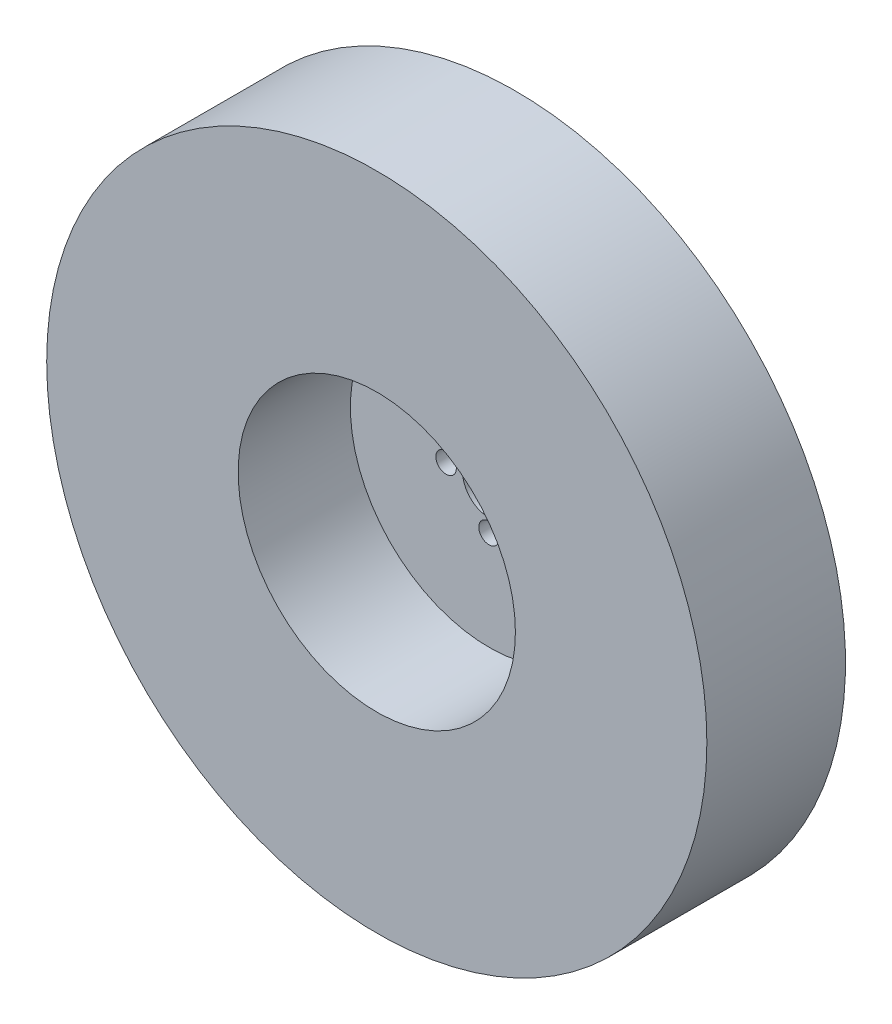
ISO-10303-21;
HEADER;
FILE_DESCRIPTION(('STEP AP214'),'2;1');
FILE_NAME('part.step','',(''),(''),'','','');
FILE_SCHEMA(('AUTOMOTIVE_DESIGN { 1 0 10303 214 1 1 1 1 }'));
ENDSEC;
DATA;
#1=APPLICATION_CONTEXT('core data for automotive mechanical design processes');
#2=APPLICATION_PROTOCOL_DEFINITION('international standard','automotive_design',2000,#1);
#3=PRODUCT_CONTEXT('',#1,'mechanical');
#4=PRODUCT('Part','Part','',(#3));
#5=PRODUCT_RELATED_PRODUCT_CATEGORY('part','',(#4));
#6=PRODUCT_DEFINITION_FORMATION('','',#4);
#7=PRODUCT_DEFINITION_CONTEXT('part definition',#1,'design');
#8=PRODUCT_DEFINITION('design','',#6,#7);
#9=PRODUCT_DEFINITION_SHAPE('','',#8);
#10=(LENGTH_UNIT() NAMED_UNIT(*) SI_UNIT(.MILLI.,.METRE.));
#11=(NAMED_UNIT(*) PLANE_ANGLE_UNIT() SI_UNIT($,.RADIAN.));
#12=(NAMED_UNIT(*) SI_UNIT($,.STERADIAN.) SOLID_ANGLE_UNIT());
#13=UNCERTAINTY_MEASURE_WITH_UNIT(LENGTH_MEASURE(1.E-05),#10,'distance_accuracy_value','');
#14=(GEOMETRIC_REPRESENTATION_CONTEXT(3) GLOBAL_UNCERTAINTY_ASSIGNED_CONTEXT((#13)) GLOBAL_UNIT_ASSIGNED_CONTEXT((#10,
#11,#12)) REPRESENTATION_CONTEXT('',''));
#15=CARTESIAN_POINT('',(0.,0.,0.));
#16=DIRECTION('',(0.,0.,1.));
#17=DIRECTION('',(1.,0.,0.));
#18=AXIS2_PLACEMENT_3D('',#15,#16,#17);
#19=CARTESIAN_POINT('',(0.,0.,17.));
#20=DIRECTION('',(0.,0.,1.));
#21=DIRECTION('',(1.,0.,0.));
#22=AXIS2_PLACEMENT_3D('',#19,#20,#21);
#23=PLANE('',#22);
#24=CARTESIAN_POINT('',(0.,0.,17.));
#25=DIRECTION('',(0.,0.,1.));
#26=DIRECTION('',(1.,0.,0.));
#27=AXIS2_PLACEMENT_3D('',#24,#25,#26);
#28=CIRCLE('',#27,50.);
#29=CARTESIAN_POINT('',(50.,0.,17.));
#30=VERTEX_POINT('',#29);
#31=EDGE_CURVE('E10',#30,#30,#28,.T.);
#32=ORIENTED_EDGE('',*,*,#31,.T.);
#33=EDGE_LOOP('',(#32));
#34=FACE_BOUND('',#33,.T.);
#35=CARTESIAN_POINT('',(0.,0.,17.));
#36=DIRECTION('',(0.,0.,1.));
#37=DIRECTION('',(1.,0.,0.));
#38=AXIS2_PLACEMENT_3D('',#35,#36,#37);
#39=CIRCLE('',#38,21.);
#40=CARTESIAN_POINT('',(21.,0.,17.));
#41=VERTEX_POINT('',#40);
#42=EDGE_CURVE('E39',#41,#41,#39,.T.);
#43=ORIENTED_EDGE('',*,*,#42,.F.);
#44=EDGE_LOOP('',(#43));
#45=FACE_BOUND('',#44,.T.);
#46=ADVANCED_FACE('F31',(#34,#45),#23,.T.);
#47=CARTESIAN_POINT('',(0.,0.,17.));
#48=DIRECTION('',(0.,0.,-1.));
#49=DIRECTION('',(-1.,0.,0.));
#50=AXIS2_PLACEMENT_3D('',#47,#48,#49);
#51=CYLINDRICAL_SURFACE('',#50,50.);
#52=ORIENTED_EDGE('',*,*,#31,.F.);
#53=EDGE_LOOP('',(#52));
#54=FACE_BOUND('',#53,.T.);
#55=CARTESIAN_POINT('',(0.,0.,-4.));
#56=DIRECTION('',(0.,0.,-1.));
#57=DIRECTION('',(-1.,0.,0.));
#58=AXIS2_PLACEMENT_3D('',#55,#56,#57);
#59=CIRCLE('',#58,50.);
#60=CARTESIAN_POINT('',(-50.,0.,-4.));
#61=VERTEX_POINT('',#60);
#62=EDGE_CURVE('E76',#61,#61,#59,.T.);
#63=ORIENTED_EDGE('',*,*,#62,.F.);
#64=EDGE_LOOP('',(#63));
#65=FACE_BOUND('',#64,.T.);
#66=ADVANCED_FACE('F33',(#54,#65),#51,.T.);
#67=CARTESIAN_POINT('',(0.,0.,17.));
#68=DIRECTION('',(0.,0.,-1.));
#69=DIRECTION('',(-1.,0.,0.));
#70=AXIS2_PLACEMENT_3D('',#67,#68,#69);
#71=CYLINDRICAL_SURFACE('',#70,21.);
#72=ORIENTED_EDGE('',*,*,#42,.T.);
#73=EDGE_LOOP('',(#72));
#74=FACE_BOUND('',#73,.T.);
#75=CARTESIAN_POINT('',(0.,0.,0.));
#76=DIRECTION('',(0.,0.,1.));
#77=DIRECTION('',(1.,0.,0.));
#78=AXIS2_PLACEMENT_3D('',#75,#76,#77);
#79=CIRCLE('',#78,21.);
#80=CARTESIAN_POINT('',(21.,0.,0.));
#81=VERTEX_POINT('',#80);
#82=EDGE_CURVE('E44',#81,#81,#79,.T.);
#83=ORIENTED_EDGE('',*,*,#82,.F.);
#84=EDGE_LOOP('',(#83));
#85=FACE_BOUND('',#84,.T.);
#86=ADVANCED_FACE('F85',(#74,#85),#71,.F.);
#87=CARTESIAN_POINT('',(0.,0.,0.));
#88=DIRECTION('',(0.,0.,-1.));
#89=DIRECTION('',(-1.,0.,0.));
#90=AXIS2_PLACEMENT_3D('',#87,#88,#89);
#91=PLANE('',#90);
#92=CARTESIAN_POINT('',(0.,6.,0.));
#93=DIRECTION('',(0.,0.,-1.));
#94=DIRECTION('',(-1.,0.,0.));
#95=AXIS2_PLACEMENT_3D('',#92,#93,#94);
#96=CIRCLE('',#95,1.55);
#97=CARTESIAN_POINT('',(-1.55,6.,0.));
#98=VERTEX_POINT('',#97);
#99=EDGE_CURVE('E73',#98,#98,#96,.T.);
#100=ORIENTED_EDGE('',*,*,#99,.T.);
#101=EDGE_LOOP('',(#100));
#102=FACE_BOUND('',#101,.T.);
#103=CARTESIAN_POINT('',(0.,-6.,0.));
#104=DIRECTION('',(0.,0.,-1.));
#105=DIRECTION('',(-1.,0.,0.));
#106=AXIS2_PLACEMENT_3D('',#103,#104,#105);
#107=CIRCLE('',#106,1.55);
#108=CARTESIAN_POINT('',(-1.55,-6.,0.));
#109=VERTEX_POINT('',#108);
#110=EDGE_CURVE('E61',#109,#109,#107,.T.);
#111=ORIENTED_EDGE('',*,*,#110,.T.);
#112=EDGE_LOOP('',(#111));
#113=FACE_BOUND('',#112,.T.);
#114=CARTESIAN_POINT('',(6.5,0.,0.));
#115=DIRECTION('',(0.,0.,-1.));
#116=DIRECTION('',(-1.,0.,0.));
#117=AXIS2_PLACEMENT_3D('',#114,#115,#116);
#118=CIRCLE('',#117,1.55);
#119=CARTESIAN_POINT('',(4.95,0.,0.));
#120=VERTEX_POINT('',#119);
#121=EDGE_CURVE('E58',#120,#120,#118,.T.);
#122=ORIENTED_EDGE('',*,*,#121,.T.);
#123=EDGE_LOOP('',(#122));
#124=FACE_BOUND('',#123,.T.);
#125=CARTESIAN_POINT('',(-6.5,0.,0.));
#126=DIRECTION('',(0.,0.,-1.));
#127=DIRECTION('',(-1.,0.,0.));
#128=AXIS2_PLACEMENT_3D('',#125,#126,#127);
#129=CIRCLE('',#128,1.55);
#130=CARTESIAN_POINT('',(-8.05,0.,0.));
#131=VERTEX_POINT('',#130);
#132=EDGE_CURVE('E55',#131,#131,#129,.T.);
#133=ORIENTED_EDGE('',*,*,#132,.T.);
#134=EDGE_LOOP('',(#133));
#135=FACE_BOUND('',#134,.T.);
#136=CARTESIAN_POINT('',(0.,0.,0.));
#137=DIRECTION('',(0.,0.,-1.));
#138=DIRECTION('',(-1.,0.,0.));
#139=AXIS2_PLACEMENT_3D('',#136,#137,#138);
#140=CIRCLE('',#139,4.);
#141=CARTESIAN_POINT('',(-4.,0.,0.));
#142=VERTEX_POINT('',#141);
#143=EDGE_CURVE('E51',#142,#142,#140,.T.);
#144=ORIENTED_EDGE('',*,*,#143,.T.);
#145=EDGE_LOOP('',(#144));
#146=FACE_BOUND('',#145,.T.);
#147=ORIENTED_EDGE('',*,*,#82,.T.);
#148=EDGE_LOOP('',(#147));
#149=FACE_BOUND('',#148,.T.);
#150=ADVANCED_FACE('F83',(#102,#113,#124,#135,#146,#149),#91,.F.);
#151=CARTESIAN_POINT('',(0.,0.,-4.));
#152=DIRECTION('',(0.,0.,-1.));
#153=DIRECTION('',(-1.,0.,0.));
#154=AXIS2_PLACEMENT_3D('',#151,#152,#153);
#155=PLANE('',#154);
#156=CARTESIAN_POINT('',(0.,6.,-4.));
#157=DIRECTION('',(0.,0.,-1.));
#158=DIRECTION('',(-1.,0.,0.));
#159=AXIS2_PLACEMENT_3D('',#156,#157,#158);
#160=CIRCLE('',#159,1.55);
#161=CARTESIAN_POINT('',(-1.55,6.,-4.));
#162=VERTEX_POINT('',#161);
#163=EDGE_CURVE('E35',#162,#162,#160,.T.);
#164=ORIENTED_EDGE('',*,*,#163,.F.);
#165=EDGE_LOOP('',(#164));
#166=FACE_BOUND('',#165,.T.);
#167=CARTESIAN_POINT('',(0.,-6.,-4.));
#168=DIRECTION('',(0.,0.,-1.));
#169=DIRECTION('',(-1.,0.,0.));
#170=AXIS2_PLACEMENT_3D('',#167,#168,#169);
#171=CIRCLE('',#170,1.55);
#172=CARTESIAN_POINT('',(-1.55,-6.,-4.));
#173=VERTEX_POINT('',#172);
#174=EDGE_CURVE('E59',#173,#173,#171,.T.);
#175=ORIENTED_EDGE('',*,*,#174,.F.);
#176=EDGE_LOOP('',(#175));
#177=FACE_BOUND('',#176,.T.);
#178=CARTESIAN_POINT('',(6.5,0.,-4.));
#179=DIRECTION('',(0.,0.,-1.));
#180=DIRECTION('',(-1.,0.,0.));
#181=AXIS2_PLACEMENT_3D('',#178,#179,#180);
#182=CIRCLE('',#181,1.55);
#183=CARTESIAN_POINT('',(4.95,0.,-4.));
#184=VERTEX_POINT('',#183);
#185=EDGE_CURVE('E56',#184,#184,#182,.T.);
#186=ORIENTED_EDGE('',*,*,#185,.F.);
#187=EDGE_LOOP('',(#186));
#188=FACE_BOUND('',#187,.T.);
#189=CARTESIAN_POINT('',(-6.5,0.,-4.));
#190=DIRECTION('',(0.,0.,-1.));
#191=DIRECTION('',(-1.,0.,0.));
#192=AXIS2_PLACEMENT_3D('',#189,#190,#191);
#193=CIRCLE('',#192,1.55);
#194=CARTESIAN_POINT('',(-8.05,0.,-4.));
#195=VERTEX_POINT('',#194);
#196=EDGE_CURVE('E52',#195,#195,#193,.T.);
#197=ORIENTED_EDGE('',*,*,#196,.F.);
#198=EDGE_LOOP('',(#197));
#199=FACE_BOUND('',#198,.T.);
#200=CARTESIAN_POINT('',(0.,0.,-4.));
#201=DIRECTION('',(0.,0.,-1.));
#202=DIRECTION('',(-1.,0.,0.));
#203=AXIS2_PLACEMENT_3D('',#200,#201,#202);
#204=CIRCLE('',#203,4.);
#205=CARTESIAN_POINT('',(-4.,0.,-4.));
#206=VERTEX_POINT('',#205);
#207=EDGE_CURVE('E48',#206,#206,#204,.T.);
#208=ORIENTED_EDGE('',*,*,#207,.F.);
#209=EDGE_LOOP('',(#208));
#210=FACE_BOUND('',#209,.T.);
#211=ORIENTED_EDGE('',*,*,#62,.T.);
#212=EDGE_LOOP('',(#211));
#213=FACE_BOUND('',#212,.T.);
#214=ADVANCED_FACE('F93',(#166,#177,#188,#199,#210,#213),#155,.T.);
#215=CARTESIAN_POINT('',(0.,0.,17.));
#216=DIRECTION('',(0.,0.,-1.));
#217=DIRECTION('',(-1.,0.,0.));
#218=AXIS2_PLACEMENT_3D('',#215,#216,#217);
#219=CYLINDRICAL_SURFACE('',#218,4.);
#220=CARTESIAN_POINT('',(-4.,0.,-4.));
#221=CARTESIAN_POINT('',(-4.,0.,-3.95833333333333));
#222=CARTESIAN_POINT('',(-4.,0.,-3.91666666666667));
#223=CARTESIAN_POINT('',(-4.,0.,-3.83333333333333));
#224=CARTESIAN_POINT('',(-4.,0.,-3.79166666666667));
#225=CARTESIAN_POINT('',(-4.,0.,-3.70833333333333));
#226=CARTESIAN_POINT('',(-4.,0.,-3.66666666666667));
#227=CARTESIAN_POINT('',(-4.,0.,-3.58333333333333));
#228=CARTESIAN_POINT('',(-4.,0.,-3.54166666666667));
#229=CARTESIAN_POINT('',(-4.,0.,-3.45833333333333));
#230=CARTESIAN_POINT('',(-4.,0.,-3.41666666666667));
#231=CARTESIAN_POINT('',(-4.,0.,-3.33333333333333));
#232=CARTESIAN_POINT('',(-4.,0.,-3.29166666666667));
#233=CARTESIAN_POINT('',(-4.,0.,-3.20833333333333));
#234=CARTESIAN_POINT('',(-4.,0.,-3.16666666666667));
#235=CARTESIAN_POINT('',(-4.,0.,-3.08333333333333));
#236=CARTESIAN_POINT('',(-4.,0.,-3.04166666666667));
#237=CARTESIAN_POINT('',(-4.,0.,-2.95833333333333));
#238=CARTESIAN_POINT('',(-4.,0.,-2.91666666666667));
#239=CARTESIAN_POINT('',(-4.,0.,-2.83333333333333));
#240=CARTESIAN_POINT('',(-4.,0.,-2.79166666666667));
#241=CARTESIAN_POINT('',(-4.,0.,-2.70833333333333));
#242=CARTESIAN_POINT('',(-4.,0.,-2.66666666666667));
#243=CARTESIAN_POINT('',(-4.,0.,-2.58333333333333));
#244=CARTESIAN_POINT('',(-4.,0.,-2.54166666666667));
#245=CARTESIAN_POINT('',(-4.,0.,-2.45833333333333));
#246=CARTESIAN_POINT('',(-4.,0.,-2.41666666666667));
#247=CARTESIAN_POINT('',(-4.,0.,-2.33333333333333));
#248=CARTESIAN_POINT('',(-4.,0.,-2.29166666666667));
#249=CARTESIAN_POINT('',(-4.,0.,-2.20833333333333));
#250=CARTESIAN_POINT('',(-4.,0.,-2.16666666666667));
#251=CARTESIAN_POINT('',(-4.,0.,-2.08333333333333));
#252=CARTESIAN_POINT('',(-4.,0.,-2.04166666666667));
#253=CARTESIAN_POINT('',(-4.,0.,-1.95833333333333));
#254=CARTESIAN_POINT('',(-4.,0.,-1.91666666666666));
#255=CARTESIAN_POINT('',(-4.,0.,-1.83333333333333));
#256=CARTESIAN_POINT('',(-4.,0.,-1.79166666666666));
#257=CARTESIAN_POINT('',(-4.,0.,-1.70833333333333));
#258=CARTESIAN_POINT('',(-4.,0.,-1.66666666666666));
#259=CARTESIAN_POINT('',(-4.,0.,-1.58333333333333));
#260=CARTESIAN_POINT('',(-4.,0.,-1.54166666666666));
#261=CARTESIAN_POINT('',(-4.,0.,-1.45833333333333));
#262=CARTESIAN_POINT('',(-4.,0.,-1.41666666666666));
#263=CARTESIAN_POINT('',(-4.,0.,-1.33333333333333));
#264=CARTESIAN_POINT('',(-4.,0.,-1.29166666666666));
#265=CARTESIAN_POINT('',(-4.,0.,-1.20833333333333));
#266=CARTESIAN_POINT('',(-4.,0.,-1.16666666666666));
#267=CARTESIAN_POINT('',(-4.,0.,-1.08333333333333));
#268=CARTESIAN_POINT('',(-4.,0.,-1.04166666666666));
#269=CARTESIAN_POINT('',(-4.,0.,-0.958333333333331));
#270=CARTESIAN_POINT('',(-4.,0.,-0.916666666666664));
#271=CARTESIAN_POINT('',(-4.,0.,-0.833333333333331));
#272=CARTESIAN_POINT('',(-4.,0.,-0.791666666666664));
#273=CARTESIAN_POINT('',(-4.,0.,-0.70833333333333));
#274=CARTESIAN_POINT('',(-4.,0.,-0.666666666666664));
#275=CARTESIAN_POINT('',(-4.,0.,-0.58333333333333));
#276=CARTESIAN_POINT('',(-4.,0.,-0.541666666666664));
#277=CARTESIAN_POINT('',(-4.,0.,-0.45833333333333));
#278=CARTESIAN_POINT('',(-4.,0.,-0.416666666666664));
#279=CARTESIAN_POINT('',(-4.,0.,-0.33333333333333));
#280=CARTESIAN_POINT('',(-4.,0.,-0.291666666666663));
#281=CARTESIAN_POINT('',(-4.,0.,-0.20833333333333));
#282=CARTESIAN_POINT('',(-4.,0.,-0.166666666666663));
#283=CARTESIAN_POINT('',(-4.,0.,-0.0833333333333299));
#284=CARTESIAN_POINT('',(-4.,0.,-0.0416666666666632));
#285=CARTESIAN_POINT('',(-4.,0.,0.));
#286=B_SPLINE_CURVE_WITH_KNOTS('',3,(#220,#221,#222,#223,#224,#225,#226,#227,#228,#229,#230,
#231,#232,#233,#234,#235,#236,#237,#238,#239,#240,#241,#242,#243,#244,#245,#246,#247,#248,#249,
#250,#251,#252,#253,#254,#255,#256,#257,#258,#259,#260,#261,#262,#263,#264,#265,#266,#267,#268,
#269,#270,#271,#272,#273,#274,#275,#276,#277,#278,#279,#280,#281,#282,#283,#284,#285),
.UNSPECIFIED.,.F.,.F.,(4,2,2,2,2,2,2,2,2,2,2,2,2,2,2,2,2,2,2,2,2,2,2,2,2,2,2,2,2,2,2,2,4),(0.,
0.125,0.25,0.375,0.5,0.625000000000001,0.750000000000001,0.875000000000001,1.,1.125,1.25,1.375,
1.5,1.625,1.75,1.875,2.,2.125,2.25,2.375,2.5,2.625,2.75,2.875,3.,3.125,3.25,3.375,3.5,3.625,
3.75,3.875,4.),.UNSPECIFIED.);
#287=EDGE_CURVE('BSEAM124',#206,#142,#286,.T.);
#288=ORIENTED_EDGE('',*,*,#207,.T.);
#289=ORIENTED_EDGE('',*,*,#143,.F.);
#290=ORIENTED_EDGE('',*,*,#287,.T.);
#291=ORIENTED_EDGE('',*,*,#287,.F.);
#292=EDGE_LOOP('',(#288,#290,#289,#291));
#293=FACE_BOUND('',#292,.T.);
#294=ADVANCED_FACE('F124',(#293),#219,.F.);
#295=CARTESIAN_POINT('',(-6.5,0.,17.));
#296=DIRECTION('',(0.,0.,-1.));
#297=DIRECTION('',(-1.,0.,0.));
#298=AXIS2_PLACEMENT_3D('',#295,#296,#297);
#299=CYLINDRICAL_SURFACE('',#298,1.55);
#300=CARTESIAN_POINT('',(-8.05,0.,-4.));
#301=CARTESIAN_POINT('',(-8.05,0.,-3.95833333333333));
#302=CARTESIAN_POINT('',(-8.05,0.,-3.91666666666667));
#303=CARTESIAN_POINT('',(-8.05,0.,-3.83333333333333));
#304=CARTESIAN_POINT('',(-8.05,0.,-3.79166666666667));
#305=CARTESIAN_POINT('',(-8.05,0.,-3.70833333333333));
#306=CARTESIAN_POINT('',(-8.05,0.,-3.66666666666667));
#307=CARTESIAN_POINT('',(-8.05,0.,-3.58333333333333));
#308=CARTESIAN_POINT('',(-8.05,0.,-3.54166666666667));
#309=CARTESIAN_POINT('',(-8.05,0.,-3.45833333333333));
#310=CARTESIAN_POINT('',(-8.05,0.,-3.41666666666667));
#311=CARTESIAN_POINT('',(-8.05,0.,-3.33333333333333));
#312=CARTESIAN_POINT('',(-8.05,0.,-3.29166666666667));
#313=CARTESIAN_POINT('',(-8.05,0.,-3.20833333333333));
#314=CARTESIAN_POINT('',(-8.05,0.,-3.16666666666667));
#315=CARTESIAN_POINT('',(-8.05,0.,-3.08333333333333));
#316=CARTESIAN_POINT('',(-8.05,0.,-3.04166666666667));
#317=CARTESIAN_POINT('',(-8.05,0.,-2.95833333333333));
#318=CARTESIAN_POINT('',(-8.05,0.,-2.91666666666667));
#319=CARTESIAN_POINT('',(-8.05,0.,-2.83333333333333));
#320=CARTESIAN_POINT('',(-8.05,0.,-2.79166666666667));
#321=CARTESIAN_POINT('',(-8.05,0.,-2.70833333333333));
#322=CARTESIAN_POINT('',(-8.05,0.,-2.66666666666667));
#323=CARTESIAN_POINT('',(-8.05,0.,-2.58333333333333));
#324=CARTESIAN_POINT('',(-8.05,0.,-2.54166666666667));
#325=CARTESIAN_POINT('',(-8.05,0.,-2.45833333333333));
#326=CARTESIAN_POINT('',(-8.05,0.,-2.41666666666667));
#327=CARTESIAN_POINT('',(-8.05,0.,-2.33333333333333));
#328=CARTESIAN_POINT('',(-8.05,0.,-2.29166666666667));
#329=CARTESIAN_POINT('',(-8.05,0.,-2.20833333333333));
#330=CARTESIAN_POINT('',(-8.05,0.,-2.16666666666667));
#331=CARTESIAN_POINT('',(-8.05,0.,-2.08333333333333));
#332=CARTESIAN_POINT('',(-8.05,0.,-2.04166666666667));
#333=CARTESIAN_POINT('',(-8.05,0.,-1.95833333333333));
#334=CARTESIAN_POINT('',(-8.05,0.,-1.91666666666666));
#335=CARTESIAN_POINT('',(-8.05,0.,-1.83333333333333));
#336=CARTESIAN_POINT('',(-8.05,0.,-1.79166666666666));
#337=CARTESIAN_POINT('',(-8.05,0.,-1.70833333333333));
#338=CARTESIAN_POINT('',(-8.05,0.,-1.66666666666666));
#339=CARTESIAN_POINT('',(-8.05,0.,-1.58333333333333));
#340=CARTESIAN_POINT('',(-8.05,0.,-1.54166666666666));
#341=CARTESIAN_POINT('',(-8.05,0.,-1.45833333333333));
#342=CARTESIAN_POINT('',(-8.05,0.,-1.41666666666666));
#343=CARTESIAN_POINT('',(-8.05,0.,-1.33333333333333));
#344=CARTESIAN_POINT('',(-8.05,0.,-1.29166666666666));
#345=CARTESIAN_POINT('',(-8.05,0.,-1.20833333333333));
#346=CARTESIAN_POINT('',(-8.05,0.,-1.16666666666666));
#347=CARTESIAN_POINT('',(-8.05,0.,-1.08333333333333));
#348=CARTESIAN_POINT('',(-8.05,0.,-1.04166666666666));
#349=CARTESIAN_POINT('',(-8.05,0.,-0.958333333333331));
#350=CARTESIAN_POINT('',(-8.05,0.,-0.916666666666664));
#351=CARTESIAN_POINT('',(-8.05,0.,-0.833333333333331));
#352=CARTESIAN_POINT('',(-8.05,0.,-0.791666666666664));
#353=CARTESIAN_POINT('',(-8.05,0.,-0.70833333333333));
#354=CARTESIAN_POINT('',(-8.05,0.,-0.666666666666664));
#355=CARTESIAN_POINT('',(-8.05,0.,-0.58333333333333));
#356=CARTESIAN_POINT('',(-8.05,0.,-0.541666666666664));
#357=CARTESIAN_POINT('',(-8.05,0.,-0.45833333333333));
#358=CARTESIAN_POINT('',(-8.05,0.,-0.416666666666664));
#359=CARTESIAN_POINT('',(-8.05,0.,-0.33333333333333));
#360=CARTESIAN_POINT('',(-8.05,0.,-0.291666666666663));
#361=CARTESIAN_POINT('',(-8.05,0.,-0.20833333333333));
#362=CARTESIAN_POINT('',(-8.05,0.,-0.166666666666663));
#363=CARTESIAN_POINT('',(-8.05,0.,-0.0833333333333299));
#364=CARTESIAN_POINT('',(-8.05,0.,-0.0416666666666632));
#365=CARTESIAN_POINT('',(-8.05,0.,0.));
#366=B_SPLINE_CURVE_WITH_KNOTS('',3,(#300,#301,#302,#303,#304,#305,#306,#307,#308,#309,#310,
#311,#312,#313,#314,#315,#316,#317,#318,#319,#320,#321,#322,#323,#324,#325,#326,#327,#328,#329,
#330,#331,#332,#333,#334,#335,#336,#337,#338,#339,#340,#341,#342,#343,#344,#345,#346,#347,#348,
#349,#350,#351,#352,#353,#354,#355,#356,#357,#358,#359,#360,#361,#362,#363,#364,#365),
.UNSPECIFIED.,.F.,.F.,(4,2,2,2,2,2,2,2,2,2,2,2,2,2,2,2,2,2,2,2,2,2,2,2,2,2,2,2,2,2,2,2,4),(0.,
0.125,0.25,0.375,0.5,0.625000000000001,0.750000000000001,0.875000000000001,1.,1.125,1.25,1.375,
1.5,1.625,1.75,1.875,2.,2.125,2.25,2.375,2.5,2.625,2.75,2.875,3.,3.125,3.25,3.375,3.5,3.625,
3.75,3.875,4.),.UNSPECIFIED.);
#367=EDGE_CURVE('BSEAM134',#195,#131,#366,.T.);
#368=ORIENTED_EDGE('',*,*,#196,.T.);
#369=ORIENTED_EDGE('',*,*,#132,.F.);
#370=ORIENTED_EDGE('',*,*,#367,.T.);
#371=ORIENTED_EDGE('',*,*,#367,.F.);
#372=EDGE_LOOP('',(#368,#370,#369,#371));
#373=FACE_BOUND('',#372,.T.);
#374=ADVANCED_FACE('F134',(#373),#299,.F.);
#375=CARTESIAN_POINT('',(6.5,0.,17.));
#376=DIRECTION('',(0.,0.,-1.));
#377=DIRECTION('',(-1.,0.,0.));
#378=AXIS2_PLACEMENT_3D('',#375,#376,#377);
#379=CYLINDRICAL_SURFACE('',#378,1.55);
#380=CARTESIAN_POINT('',(4.95,0.,-4.));
#381=CARTESIAN_POINT('',(4.95,0.,-3.95833333333333));
#382=CARTESIAN_POINT('',(4.95,0.,-3.91666666666667));
#383=CARTESIAN_POINT('',(4.95,0.,-3.83333333333333));
#384=CARTESIAN_POINT('',(4.95,0.,-3.79166666666667));
#385=CARTESIAN_POINT('',(4.95,0.,-3.70833333333333));
#386=CARTESIAN_POINT('',(4.95,0.,-3.66666666666667));
#387=CARTESIAN_POINT('',(4.95,0.,-3.58333333333333));
#388=CARTESIAN_POINT('',(4.95,0.,-3.54166666666667));
#389=CARTESIAN_POINT('',(4.95,0.,-3.45833333333333));
#390=CARTESIAN_POINT('',(4.95,0.,-3.41666666666667));
#391=CARTESIAN_POINT('',(4.95,0.,-3.33333333333333));
#392=CARTESIAN_POINT('',(4.95,0.,-3.29166666666667));
#393=CARTESIAN_POINT('',(4.95,0.,-3.20833333333333));
#394=CARTESIAN_POINT('',(4.95,0.,-3.16666666666667));
#395=CARTESIAN_POINT('',(4.95,0.,-3.08333333333333));
#396=CARTESIAN_POINT('',(4.95,0.,-3.04166666666667));
#397=CARTESIAN_POINT('',(4.95,0.,-2.95833333333333));
#398=CARTESIAN_POINT('',(4.95,0.,-2.91666666666667));
#399=CARTESIAN_POINT('',(4.95,0.,-2.83333333333333));
#400=CARTESIAN_POINT('',(4.95,0.,-2.79166666666667));
#401=CARTESIAN_POINT('',(4.95,0.,-2.70833333333333));
#402=CARTESIAN_POINT('',(4.95,0.,-2.66666666666667));
#403=CARTESIAN_POINT('',(4.95,0.,-2.58333333333333));
#404=CARTESIAN_POINT('',(4.95,0.,-2.54166666666667));
#405=CARTESIAN_POINT('',(4.95,0.,-2.45833333333333));
#406=CARTESIAN_POINT('',(4.95,0.,-2.41666666666667));
#407=CARTESIAN_POINT('',(4.95,0.,-2.33333333333333));
#408=CARTESIAN_POINT('',(4.95,0.,-2.29166666666667));
#409=CARTESIAN_POINT('',(4.95,0.,-2.20833333333333));
#410=CARTESIAN_POINT('',(4.95,0.,-2.16666666666667));
#411=CARTESIAN_POINT('',(4.95,0.,-2.08333333333333));
#412=CARTESIAN_POINT('',(4.95,0.,-2.04166666666667));
#413=CARTESIAN_POINT('',(4.95,0.,-1.95833333333333));
#414=CARTESIAN_POINT('',(4.95,0.,-1.91666666666666));
#415=CARTESIAN_POINT('',(4.95,0.,-1.83333333333333));
#416=CARTESIAN_POINT('',(4.95,0.,-1.79166666666666));
#417=CARTESIAN_POINT('',(4.95,0.,-1.70833333333333));
#418=CARTESIAN_POINT('',(4.95,0.,-1.66666666666666));
#419=CARTESIAN_POINT('',(4.95,0.,-1.58333333333333));
#420=CARTESIAN_POINT('',(4.95,0.,-1.54166666666666));
#421=CARTESIAN_POINT('',(4.95,0.,-1.45833333333333));
#422=CARTESIAN_POINT('',(4.95,0.,-1.41666666666666));
#423=CARTESIAN_POINT('',(4.95,0.,-1.33333333333333));
#424=CARTESIAN_POINT('',(4.95,0.,-1.29166666666666));
#425=CARTESIAN_POINT('',(4.95,0.,-1.20833333333333));
#426=CARTESIAN_POINT('',(4.95,0.,-1.16666666666666));
#427=CARTESIAN_POINT('',(4.95,0.,-1.08333333333333));
#428=CARTESIAN_POINT('',(4.95,0.,-1.04166666666666));
#429=CARTESIAN_POINT('',(4.95,0.,-0.958333333333331));
#430=CARTESIAN_POINT('',(4.95,0.,-0.916666666666664));
#431=CARTESIAN_POINT('',(4.95,0.,-0.833333333333331));
#432=CARTESIAN_POINT('',(4.95,0.,-0.791666666666664));
#433=CARTESIAN_POINT('',(4.95,0.,-0.70833333333333));
#434=CARTESIAN_POINT('',(4.95,0.,-0.666666666666664));
#435=CARTESIAN_POINT('',(4.95,0.,-0.58333333333333));
#436=CARTESIAN_POINT('',(4.95,0.,-0.541666666666664));
#437=CARTESIAN_POINT('',(4.95,0.,-0.45833333333333));
#438=CARTESIAN_POINT('',(4.95,0.,-0.416666666666664));
#439=CARTESIAN_POINT('',(4.95,0.,-0.33333333333333));
#440=CARTESIAN_POINT('',(4.95,0.,-0.291666666666663));
#441=CARTESIAN_POINT('',(4.95,0.,-0.20833333333333));
#442=CARTESIAN_POINT('',(4.95,0.,-0.166666666666663));
#443=CARTESIAN_POINT('',(4.95,0.,-0.0833333333333299));
#444=CARTESIAN_POINT('',(4.95,0.,-0.0416666666666632));
#445=CARTESIAN_POINT('',(4.95,0.,0.));
#446=B_SPLINE_CURVE_WITH_KNOTS('',3,(#380,#381,#382,#383,#384,#385,#386,#387,#388,#389,#390,
#391,#392,#393,#394,#395,#396,#397,#398,#399,#400,#401,#402,#403,#404,#405,#406,#407,#408,#409,
#410,#411,#412,#413,#414,#415,#416,#417,#418,#419,#420,#421,#422,#423,#424,#425,#426,#427,#428,
#429,#430,#431,#432,#433,#434,#435,#436,#437,#438,#439,#440,#441,#442,#443,#444,#445),
.UNSPECIFIED.,.F.,.F.,(4,2,2,2,2,2,2,2,2,2,2,2,2,2,2,2,2,2,2,2,2,2,2,2,2,2,2,2,2,2,2,2,4),(0.,
0.125,0.25,0.375,0.5,0.625000000000001,0.750000000000001,0.875000000000001,1.,1.125,1.25,1.375,
1.5,1.625,1.75,1.875,2.,2.125,2.25,2.375,2.5,2.625,2.75,2.875,3.,3.125,3.25,3.375,3.5,3.625,
3.75,3.875,4.),.UNSPECIFIED.);
#447=EDGE_CURVE('BSEAM144',#184,#120,#446,.T.);
#448=ORIENTED_EDGE('',*,*,#185,.T.);
#449=ORIENTED_EDGE('',*,*,#121,.F.);
#450=ORIENTED_EDGE('',*,*,#447,.T.);
#451=ORIENTED_EDGE('',*,*,#447,.F.);
#452=EDGE_LOOP('',(#448,#450,#449,#451));
#453=FACE_BOUND('',#452,.T.);
#454=ADVANCED_FACE('F144',(#453),#379,.F.);
#455=CARTESIAN_POINT('',(0.,-6.,17.));
#456=DIRECTION('',(0.,0.,-1.));
#457=DIRECTION('',(-1.,0.,0.));
#458=AXIS2_PLACEMENT_3D('',#455,#456,#457);
#459=CYLINDRICAL_SURFACE('',#458,1.55);
#460=CARTESIAN_POINT('',(-1.55,-6.,-4.));
#461=CARTESIAN_POINT('',(-1.55,-6.,-3.95833333333333));
#462=CARTESIAN_POINT('',(-1.55,-6.,-3.91666666666667));
#463=CARTESIAN_POINT('',(-1.55,-6.,-3.83333333333333));
#464=CARTESIAN_POINT('',(-1.55,-6.,-3.79166666666667));
#465=CARTESIAN_POINT('',(-1.55,-6.,-3.70833333333333));
#466=CARTESIAN_POINT('',(-1.55,-6.,-3.66666666666667));
#467=CARTESIAN_POINT('',(-1.55,-6.,-3.58333333333333));
#468=CARTESIAN_POINT('',(-1.55,-6.,-3.54166666666667));
#469=CARTESIAN_POINT('',(-1.55,-6.,-3.45833333333333));
#470=CARTESIAN_POINT('',(-1.55,-6.,-3.41666666666667));
#471=CARTESIAN_POINT('',(-1.55,-6.,-3.33333333333333));
#472=CARTESIAN_POINT('',(-1.55,-6.,-3.29166666666667));
#473=CARTESIAN_POINT('',(-1.55,-6.,-3.20833333333333));
#474=CARTESIAN_POINT('',(-1.55,-6.,-3.16666666666667));
#475=CARTESIAN_POINT('',(-1.55,-6.,-3.08333333333333));
#476=CARTESIAN_POINT('',(-1.55,-6.,-3.04166666666667));
#477=CARTESIAN_POINT('',(-1.55,-6.,-2.95833333333333));
#478=CARTESIAN_POINT('',(-1.55,-6.,-2.91666666666667));
#479=CARTESIAN_POINT('',(-1.55,-6.,-2.83333333333333));
#480=CARTESIAN_POINT('',(-1.55,-6.,-2.79166666666667));
#481=CARTESIAN_POINT('',(-1.55,-6.,-2.70833333333333));
#482=CARTESIAN_POINT('',(-1.55,-6.,-2.66666666666667));
#483=CARTESIAN_POINT('',(-1.55,-6.,-2.58333333333333));
#484=CARTESIAN_POINT('',(-1.55,-6.,-2.54166666666667));
#485=CARTESIAN_POINT('',(-1.55,-6.,-2.45833333333333));
#486=CARTESIAN_POINT('',(-1.55,-6.,-2.41666666666667));
#487=CARTESIAN_POINT('',(-1.55,-6.,-2.33333333333333));
#488=CARTESIAN_POINT('',(-1.55,-6.,-2.29166666666667));
#489=CARTESIAN_POINT('',(-1.55,-6.,-2.20833333333333));
#490=CARTESIAN_POINT('',(-1.55,-6.,-2.16666666666667));
#491=CARTESIAN_POINT('',(-1.55,-6.,-2.08333333333333));
#492=CARTESIAN_POINT('',(-1.55,-6.,-2.04166666666667));
#493=CARTESIAN_POINT('',(-1.55,-6.,-1.95833333333333));
#494=CARTESIAN_POINT('',(-1.55,-6.,-1.91666666666666));
#495=CARTESIAN_POINT('',(-1.55,-6.,-1.83333333333333));
#496=CARTESIAN_POINT('',(-1.55,-6.,-1.79166666666666));
#497=CARTESIAN_POINT('',(-1.55,-6.,-1.70833333333333));
#498=CARTESIAN_POINT('',(-1.55,-6.,-1.66666666666666));
#499=CARTESIAN_POINT('',(-1.55,-6.,-1.58333333333333));
#500=CARTESIAN_POINT('',(-1.55,-6.,-1.54166666666666));
#501=CARTESIAN_POINT('',(-1.55,-6.,-1.45833333333333));
#502=CARTESIAN_POINT('',(-1.55,-6.,-1.41666666666666));
#503=CARTESIAN_POINT('',(-1.55,-6.,-1.33333333333333));
#504=CARTESIAN_POINT('',(-1.55,-6.,-1.29166666666666));
#505=CARTESIAN_POINT('',(-1.55,-6.,-1.20833333333333));
#506=CARTESIAN_POINT('',(-1.55,-6.,-1.16666666666666));
#507=CARTESIAN_POINT('',(-1.55,-6.,-1.08333333333333));
#508=CARTESIAN_POINT('',(-1.55,-6.,-1.04166666666666));
#509=CARTESIAN_POINT('',(-1.55,-6.,-0.958333333333331));
#510=CARTESIAN_POINT('',(-1.55,-6.,-0.916666666666664));
#511=CARTESIAN_POINT('',(-1.55,-6.,-0.833333333333331));
#512=CARTESIAN_POINT('',(-1.55,-6.,-0.791666666666664));
#513=CARTESIAN_POINT('',(-1.55,-6.,-0.70833333333333));
#514=CARTESIAN_POINT('',(-1.55,-6.,-0.666666666666664));
#515=CARTESIAN_POINT('',(-1.55,-6.,-0.58333333333333));
#516=CARTESIAN_POINT('',(-1.55,-6.,-0.541666666666664));
#517=CARTESIAN_POINT('',(-1.55,-6.,-0.45833333333333));
#518=CARTESIAN_POINT('',(-1.55,-6.,-0.416666666666664));
#519=CARTESIAN_POINT('',(-1.55,-6.,-0.33333333333333));
#520=CARTESIAN_POINT('',(-1.55,-6.,-0.291666666666663));
#521=CARTESIAN_POINT('',(-1.55,-6.,-0.20833333333333));
#522=CARTESIAN_POINT('',(-1.55,-6.,-0.166666666666663));
#523=CARTESIAN_POINT('',(-1.55,-6.,-0.0833333333333299));
#524=CARTESIAN_POINT('',(-1.55,-6.,-0.0416666666666632));
#525=CARTESIAN_POINT('',(-1.55,-6.,0.));
#526=B_SPLINE_CURVE_WITH_KNOTS('',3,(#460,#461,#462,#463,#464,#465,#466,#467,#468,#469,#470,
#471,#472,#473,#474,#475,#476,#477,#478,#479,#480,#481,#482,#483,#484,#485,#486,#487,#488,#489,
#490,#491,#492,#493,#494,#495,#496,#497,#498,#499,#500,#501,#502,#503,#504,#505,#506,#507,#508,
#509,#510,#511,#512,#513,#514,#515,#516,#517,#518,#519,#520,#521,#522,#523,#524,#525),
.UNSPECIFIED.,.F.,.F.,(4,2,2,2,2,2,2,2,2,2,2,2,2,2,2,2,2,2,2,2,2,2,2,2,2,2,2,2,2,2,2,2,4),(0.,
0.125,0.25,0.375,0.5,0.625000000000001,0.750000000000001,0.875000000000001,1.,1.125,1.25,1.375,
1.5,1.625,1.75,1.875,2.,2.125,2.25,2.375,2.5,2.625,2.75,2.875,3.,3.125,3.25,3.375,3.5,3.625,
3.75,3.875,4.),.UNSPECIFIED.);
#527=EDGE_CURVE('BSEAM154',#173,#109,#526,.T.);
#528=ORIENTED_EDGE('',*,*,#174,.T.);
#529=ORIENTED_EDGE('',*,*,#110,.F.);
#530=ORIENTED_EDGE('',*,*,#527,.T.);
#531=ORIENTED_EDGE('',*,*,#527,.F.);
#532=EDGE_LOOP('',(#528,#530,#529,#531));
#533=FACE_BOUND('',#532,.T.);
#534=ADVANCED_FACE('F154',(#533),#459,.F.);
#535=CARTESIAN_POINT('',(0.,6.,17.));
#536=DIRECTION('',(0.,0.,-1.));
#537=DIRECTION('',(-1.,0.,0.));
#538=AXIS2_PLACEMENT_3D('',#535,#536,#537);
#539=CYLINDRICAL_SURFACE('',#538,1.55);
#540=CARTESIAN_POINT('',(-1.55,6.,-4.));
#541=CARTESIAN_POINT('',(-1.55,6.,-3.95833333333333));
#542=CARTESIAN_POINT('',(-1.55,6.,-3.91666666666667));
#543=CARTESIAN_POINT('',(-1.55,6.,-3.83333333333333));
#544=CARTESIAN_POINT('',(-1.55,6.,-3.79166666666667));
#545=CARTESIAN_POINT('',(-1.55,6.,-3.70833333333333));
#546=CARTESIAN_POINT('',(-1.55,6.,-3.66666666666667));
#547=CARTESIAN_POINT('',(-1.55,6.,-3.58333333333333));
#548=CARTESIAN_POINT('',(-1.55,6.,-3.54166666666667));
#549=CARTESIAN_POINT('',(-1.55,6.,-3.45833333333333));
#550=CARTESIAN_POINT('',(-1.55,6.,-3.41666666666667));
#551=CARTESIAN_POINT('',(-1.55,6.,-3.33333333333333));
#552=CARTESIAN_POINT('',(-1.55,6.,-3.29166666666667));
#553=CARTESIAN_POINT('',(-1.55,6.,-3.20833333333333));
#554=CARTESIAN_POINT('',(-1.55,6.,-3.16666666666667));
#555=CARTESIAN_POINT('',(-1.55,6.,-3.08333333333333));
#556=CARTESIAN_POINT('',(-1.55,6.,-3.04166666666667));
#557=CARTESIAN_POINT('',(-1.55,6.,-2.95833333333333));
#558=CARTESIAN_POINT('',(-1.55,6.,-2.91666666666667));
#559=CARTESIAN_POINT('',(-1.55,6.,-2.83333333333333));
#560=CARTESIAN_POINT('',(-1.55,6.,-2.79166666666667));
#561=CARTESIAN_POINT('',(-1.55,6.,-2.70833333333333));
#562=CARTESIAN_POINT('',(-1.55,6.,-2.66666666666667));
#563=CARTESIAN_POINT('',(-1.55,6.,-2.58333333333333));
#564=CARTESIAN_POINT('',(-1.55,6.,-2.54166666666667));
#565=CARTESIAN_POINT('',(-1.55,6.,-2.45833333333333));
#566=CARTESIAN_POINT('',(-1.55,6.,-2.41666666666667));
#567=CARTESIAN_POINT('',(-1.55,6.,-2.33333333333333));
#568=CARTESIAN_POINT('',(-1.55,6.,-2.29166666666667));
#569=CARTESIAN_POINT('',(-1.55,6.,-2.20833333333333));
#570=CARTESIAN_POINT('',(-1.55,6.,-2.16666666666667));
#571=CARTESIAN_POINT('',(-1.55,6.,-2.08333333333333));
#572=CARTESIAN_POINT('',(-1.55,6.,-2.04166666666667));
#573=CARTESIAN_POINT('',(-1.55,6.,-1.95833333333333));
#574=CARTESIAN_POINT('',(-1.55,6.,-1.91666666666666));
#575=CARTESIAN_POINT('',(-1.55,6.,-1.83333333333333));
#576=CARTESIAN_POINT('',(-1.55,6.,-1.79166666666666));
#577=CARTESIAN_POINT('',(-1.55,6.,-1.70833333333333));
#578=CARTESIAN_POINT('',(-1.55,6.,-1.66666666666666));
#579=CARTESIAN_POINT('',(-1.55,6.,-1.58333333333333));
#580=CARTESIAN_POINT('',(-1.55,6.,-1.54166666666666));
#581=CARTESIAN_POINT('',(-1.55,6.,-1.45833333333333));
#582=CARTESIAN_POINT('',(-1.55,6.,-1.41666666666666));
#583=CARTESIAN_POINT('',(-1.55,6.,-1.33333333333333));
#584=CARTESIAN_POINT('',(-1.55,6.,-1.29166666666666));
#585=CARTESIAN_POINT('',(-1.55,6.,-1.20833333333333));
#586=CARTESIAN_POINT('',(-1.55,6.,-1.16666666666666));
#587=CARTESIAN_POINT('',(-1.55,6.,-1.08333333333333));
#588=CARTESIAN_POINT('',(-1.55,6.,-1.04166666666666));
#589=CARTESIAN_POINT('',(-1.55,6.,-0.958333333333331));
#590=CARTESIAN_POINT('',(-1.55,6.,-0.916666666666664));
#591=CARTESIAN_POINT('',(-1.55,6.,-0.833333333333331));
#592=CARTESIAN_POINT('',(-1.55,6.,-0.791666666666664));
#593=CARTESIAN_POINT('',(-1.55,6.,-0.70833333333333));
#594=CARTESIAN_POINT('',(-1.55,6.,-0.666666666666664));
#595=CARTESIAN_POINT('',(-1.55,6.,-0.58333333333333));
#596=CARTESIAN_POINT('',(-1.55,6.,-0.541666666666664));
#597=CARTESIAN_POINT('',(-1.55,6.,-0.45833333333333));
#598=CARTESIAN_POINT('',(-1.55,6.,-0.416666666666664));
#599=CARTESIAN_POINT('',(-1.55,6.,-0.33333333333333));
#600=CARTESIAN_POINT('',(-1.55,6.,-0.291666666666663));
#601=CARTESIAN_POINT('',(-1.55,6.,-0.20833333333333));
#602=CARTESIAN_POINT('',(-1.55,6.,-0.166666666666663));
#603=CARTESIAN_POINT('',(-1.55,6.,-0.0833333333333299));
#604=CARTESIAN_POINT('',(-1.55,6.,-0.0416666666666632));
#605=CARTESIAN_POINT('',(-1.55,6.,0.));
#606=B_SPLINE_CURVE_WITH_KNOTS('',3,(#540,#541,#542,#543,#544,#545,#546,#547,#548,#549,#550,
#551,#552,#553,#554,#555,#556,#557,#558,#559,#560,#561,#562,#563,#564,#565,#566,#567,#568,#569,
#570,#571,#572,#573,#574,#575,#576,#577,#578,#579,#580,#581,#582,#583,#584,#585,#586,#587,#588,
#589,#590,#591,#592,#593,#594,#595,#596,#597,#598,#599,#600,#601,#602,#603,#604,#605),
.UNSPECIFIED.,.F.,.F.,(4,2,2,2,2,2,2,2,2,2,2,2,2,2,2,2,2,2,2,2,2,2,2,2,2,2,2,2,2,2,2,2,4),(0.,
0.125,0.25,0.375,0.5,0.625000000000001,0.750000000000001,0.875000000000001,1.,1.125,1.25,1.375,
1.5,1.625,1.75,1.875,2.,2.125,2.25,2.375,2.5,2.625,2.75,2.875,3.,3.125,3.25,3.375,3.5,3.625,
3.75,3.875,4.),.UNSPECIFIED.);
#607=EDGE_CURVE('BSEAM164',#162,#98,#606,.T.);
#608=ORIENTED_EDGE('',*,*,#163,.T.);
#609=ORIENTED_EDGE('',*,*,#99,.F.);
#610=ORIENTED_EDGE('',*,*,#607,.T.);
#611=ORIENTED_EDGE('',*,*,#607,.F.);
#612=EDGE_LOOP('',(#608,#610,#609,#611));
#613=FACE_BOUND('',#612,.T.);
#614=ADVANCED_FACE('F164',(#613),#539,.F.);
#615=CLOSED_SHELL('',(#46,#66,#86,#150,#214,#294,#374,#454,#534,#614));
#616=MANIFOLD_SOLID_BREP('B2',#615);
#617=ADVANCED_BREP_SHAPE_REPRESENTATION('',(#18,#616),#14);
#618=SHAPE_DEFINITION_REPRESENTATION(#9,#617);
ENDSEC;
END-ISO-10303-21;
